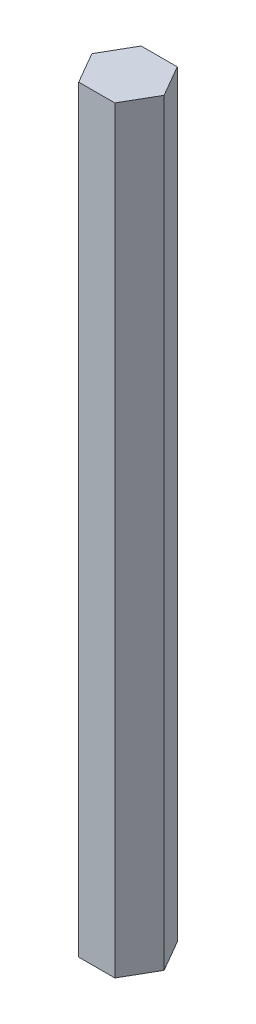
ISO-10303-21;
HEADER;
FILE_DESCRIPTION(('STEP AP214'),'2;1');
FILE_NAME('part.step','',(''),(''),'','','');
FILE_SCHEMA(('AUTOMOTIVE_DESIGN { 1 0 10303 214 1 1 1 1 }'));
ENDSEC;
DATA;
#1=APPLICATION_CONTEXT('core data for automotive mechanical design processes');
#2=APPLICATION_PROTOCOL_DEFINITION('international standard','automotive_design',2000,#1);
#3=PRODUCT_CONTEXT('',#1,'mechanical');
#4=PRODUCT('Part','Part','',(#3));
#5=PRODUCT_RELATED_PRODUCT_CATEGORY('part','',(#4));
#6=PRODUCT_DEFINITION_FORMATION('','',#4);
#7=PRODUCT_DEFINITION_CONTEXT('part definition',#1,'design');
#8=PRODUCT_DEFINITION('design','',#6,#7);
#9=PRODUCT_DEFINITION_SHAPE('','',#8);
#10=(LENGTH_UNIT() NAMED_UNIT(*) SI_UNIT(.MILLI.,.METRE.));
#11=(NAMED_UNIT(*) PLANE_ANGLE_UNIT() SI_UNIT($,.RADIAN.));
#12=(NAMED_UNIT(*) SI_UNIT($,.STERADIAN.) SOLID_ANGLE_UNIT());
#13=UNCERTAINTY_MEASURE_WITH_UNIT(LENGTH_MEASURE(1.E-05),#10,'distance_accuracy_value','');
#14=(GEOMETRIC_REPRESENTATION_CONTEXT(3) GLOBAL_UNCERTAINTY_ASSIGNED_CONTEXT((#13)) GLOBAL_UNIT_ASSIGNED_CONTEXT((#10,
#11,#12)) REPRESENTATION_CONTEXT('',''));
#15=CARTESIAN_POINT('',(0.,0.,0.));
#16=DIRECTION('',(0.,0.,1.));
#17=DIRECTION('',(1.,0.,0.));
#18=AXIS2_PLACEMENT_3D('',#15,#16,#17);
#19=CARTESIAN_POINT('',(1.5,63.,2.59807621135332));
#20=DIRECTION('',(-0.866025403784439,0.,-0.5));
#21=DIRECTION('',(-0.5,0.,0.866025403784439));
#22=AXIS2_PLACEMENT_3D('',#19,#20,#21);
#23=PLANE('',#22);
#24=DIRECTION('',(0.5,0.,-0.866025403784439));
#25=VECTOR('',#24,1.);
#26=CARTESIAN_POINT('',(1.5,0.,2.59807621135332));
#27=LINE('',#26,#25);
#28=CARTESIAN_POINT('',(1.5,0.,2.59807621135332));
#29=VERTEX_POINT('',#28);
#30=CARTESIAN_POINT('',(3.,0.,0.));
#31=VERTEX_POINT('',#30);
#32=EDGE_CURVE('E116',#29,#31,#27,.T.);
#33=ORIENTED_EDGE('',*,*,#32,.T.);
#34=DIRECTION('',(0.,-1.,0.));
#35=VECTOR('',#34,1.);
#36=CARTESIAN_POINT('',(3.,63.,0.));
#37=LINE('',#36,#35);
#38=CARTESIAN_POINT('',(3.,63.,0.));
#39=VERTEX_POINT('',#38);
#40=EDGE_CURVE('E11',#39,#31,#37,.T.);
#41=ORIENTED_EDGE('',*,*,#40,.F.);
#42=DIRECTION('',(0.5,0.,-0.866025403784439));
#43=VECTOR('',#42,1.);
#44=CARTESIAN_POINT('',(1.5,63.,2.59807621135332));
#45=LINE('',#44,#43);
#46=CARTESIAN_POINT('',(1.5,63.,2.59807621135332));
#47=VERTEX_POINT('',#46);
#48=EDGE_CURVE('E127',#47,#39,#45,.T.);
#49=ORIENTED_EDGE('',*,*,#48,.F.);
#50=DIRECTION('',(0.,-1.,0.));
#51=VECTOR('',#50,1.);
#52=CARTESIAN_POINT('',(1.5,63.,2.59807621135332));
#53=LINE('',#52,#51);
#54=EDGE_CURVE('E112',#47,#29,#53,.T.);
#55=ORIENTED_EDGE('',*,*,#54,.T.);
#56=EDGE_LOOP('',(#33,#41,#49,#55));
#57=FACE_BOUND('',#56,.T.);
#58=ADVANCED_FACE('F32',(#57),#23,.F.);
#59=CARTESIAN_POINT('',(3.,63.,0.));
#60=DIRECTION('',(-0.866025403784439,0.,0.5));
#61=DIRECTION('',(0.5,0.,0.866025403784439));
#62=AXIS2_PLACEMENT_3D('',#59,#60,#61);
#63=PLANE('',#62);
#64=DIRECTION('',(-0.5,0.,-0.866025403784439));
#65=VECTOR('',#64,1.);
#66=CARTESIAN_POINT('',(3.,0.,0.));
#67=LINE('',#66,#65);
#68=CARTESIAN_POINT('',(1.5,0.,-2.59807621135332));
#69=VERTEX_POINT('',#68);
#70=EDGE_CURVE('E119',#31,#69,#67,.T.);
#71=ORIENTED_EDGE('',*,*,#70,.T.);
#72=DIRECTION('',(0.,-1.,0.));
#73=VECTOR('',#72,1.);
#74=CARTESIAN_POINT('',(1.5,63.,-2.59807621135332));
#75=LINE('',#74,#73);
#76=CARTESIAN_POINT('',(1.5,63.,-2.59807621135332));
#77=VERTEX_POINT('',#76);
#78=EDGE_CURVE('E40',#77,#69,#75,.T.);
#79=ORIENTED_EDGE('',*,*,#78,.F.);
#80=DIRECTION('',(-0.5,0.,-0.866025403784439));
#81=VECTOR('',#80,1.);
#82=CARTESIAN_POINT('',(3.,63.,0.));
#83=LINE('',#82,#81);
#84=EDGE_CURVE('E85',#39,#77,#83,.T.);
#85=ORIENTED_EDGE('',*,*,#84,.F.);
#86=ORIENTED_EDGE('',*,*,#40,.T.);
#87=EDGE_LOOP('',(#71,#79,#85,#86));
#88=FACE_BOUND('',#87,.T.);
#89=ADVANCED_FACE('F151',(#88),#63,.F.);
#90=CARTESIAN_POINT('',(1.5,63.,-2.59807621135332));
#91=DIRECTION('',(0.,0.,1.));
#92=DIRECTION('',(1.,0.,0.));
#93=AXIS2_PLACEMENT_3D('',#90,#91,#92);
#94=PLANE('',#93);
#95=DIRECTION('',(-1.,0.,0.));
#96=VECTOR('',#95,1.);
#97=CARTESIAN_POINT('',(1.5,0.,-2.59807621135332));
#98=LINE('',#97,#96);
#99=CARTESIAN_POINT('',(-1.5,0.,-2.59807621135332));
#100=VERTEX_POINT('',#99);
#101=EDGE_CURVE('E122',#69,#100,#98,.T.);
#102=ORIENTED_EDGE('',*,*,#101,.T.);
#103=DIRECTION('',(0.,-1.,0.));
#104=VECTOR('',#103,1.);
#105=CARTESIAN_POINT('',(-1.5,63.,-2.59807621135332));
#106=LINE('',#105,#104);
#107=CARTESIAN_POINT('',(-1.5,63.,-2.59807621135332));
#108=VERTEX_POINT('',#107);
#109=EDGE_CURVE('E107',#108,#100,#106,.T.);
#110=ORIENTED_EDGE('',*,*,#109,.F.);
#111=DIRECTION('',(-1.,0.,0.));
#112=VECTOR('',#111,1.);
#113=CARTESIAN_POINT('',(1.5,63.,-2.59807621135332));
#114=LINE('',#113,#112);
#115=EDGE_CURVE('E98',#77,#108,#114,.T.);
#116=ORIENTED_EDGE('',*,*,#115,.F.);
#117=ORIENTED_EDGE('',*,*,#78,.T.);
#118=EDGE_LOOP('',(#102,#110,#116,#117));
#119=FACE_BOUND('',#118,.T.);
#120=ADVANCED_FACE('F133',(#119),#94,.F.);
#121=CARTESIAN_POINT('',(-1.5,63.,-2.59807621135332));
#122=DIRECTION('',(0.866025403784439,0.,0.5));
#123=DIRECTION('',(0.5,0.,-0.866025403784439));
#124=AXIS2_PLACEMENT_3D('',#121,#122,#123);
#125=PLANE('',#124);
#126=DIRECTION('',(-0.5,0.,0.866025403784439));
#127=VECTOR('',#126,1.);
#128=CARTESIAN_POINT('',(-1.5,0.,-2.59807621135332));
#129=LINE('',#128,#127);
#130=CARTESIAN_POINT('',(-3.,0.,0.));
#131=VERTEX_POINT('',#130);
#132=EDGE_CURVE('E106',#100,#131,#129,.T.);
#133=ORIENTED_EDGE('',*,*,#132,.T.);
#134=DIRECTION('',(0.,-1.,0.));
#135=VECTOR('',#134,1.);
#136=CARTESIAN_POINT('',(-3.,63.,0.));
#137=LINE('',#136,#135);
#138=CARTESIAN_POINT('',(-3.,63.,0.));
#139=VERTEX_POINT('',#138);
#140=EDGE_CURVE('E103',#139,#131,#137,.T.);
#141=ORIENTED_EDGE('',*,*,#140,.F.);
#142=DIRECTION('',(-0.5,0.,0.866025403784439));
#143=VECTOR('',#142,1.);
#144=CARTESIAN_POINT('',(-1.5,63.,-2.59807621135332));
#145=LINE('',#144,#143);
#146=EDGE_CURVE('E92',#108,#139,#145,.T.);
#147=ORIENTED_EDGE('',*,*,#146,.F.);
#148=ORIENTED_EDGE('',*,*,#109,.T.);
#149=EDGE_LOOP('',(#133,#141,#147,#148));
#150=FACE_BOUND('',#149,.T.);
#151=ADVANCED_FACE('F104',(#150),#125,.F.);
#152=CARTESIAN_POINT('',(-3.,63.,0.));
#153=DIRECTION('',(0.866025403784439,0.,-0.5));
#154=DIRECTION('',(-0.5,0.,-0.866025403784439));
#155=AXIS2_PLACEMENT_3D('',#152,#153,#154);
#156=PLANE('',#155);
#157=DIRECTION('',(0.5,0.,0.866025403784439));
#158=VECTOR('',#157,1.);
#159=CARTESIAN_POINT('',(-3.,0.,0.));
#160=LINE('',#159,#158);
#161=CARTESIAN_POINT('',(-1.5,0.,2.59807621135332));
#162=VERTEX_POINT('',#161);
#163=EDGE_CURVE('E71',#131,#162,#160,.T.);
#164=ORIENTED_EDGE('',*,*,#163,.T.);
#165=DIRECTION('',(0.,-1.,0.));
#166=VECTOR('',#165,1.);
#167=CARTESIAN_POINT('',(-1.5,63.,2.59807621135332));
#168=LINE('',#167,#166);
#169=CARTESIAN_POINT('',(-1.5,63.,2.59807621135332));
#170=VERTEX_POINT('',#169);
#171=EDGE_CURVE('E108',#170,#162,#168,.T.);
#172=ORIENTED_EDGE('',*,*,#171,.F.);
#173=DIRECTION('',(0.5,0.,0.866025403784439));
#174=VECTOR('',#173,1.);
#175=CARTESIAN_POINT('',(-3.,63.,0.));
#176=LINE('',#175,#174);
#177=EDGE_CURVE('E96',#139,#170,#176,.T.);
#178=ORIENTED_EDGE('',*,*,#177,.F.);
#179=ORIENTED_EDGE('',*,*,#140,.T.);
#180=EDGE_LOOP('',(#164,#172,#178,#179));
#181=FACE_BOUND('',#180,.T.);
#182=ADVANCED_FACE('F110',(#181),#156,.F.);
#183=CARTESIAN_POINT('',(-1.5,63.,2.59807621135332));
#184=DIRECTION('',(0.,0.,-1.));
#185=DIRECTION('',(-1.,0.,0.));
#186=AXIS2_PLACEMENT_3D('',#183,#184,#185);
#187=PLANE('',#186);
#188=DIRECTION('',(1.,0.,0.));
#189=VECTOR('',#188,1.);
#190=CARTESIAN_POINT('',(-1.5,0.,2.59807621135332));
#191=LINE('',#190,#189);
#192=EDGE_CURVE('E77',#162,#29,#191,.T.);
#193=ORIENTED_EDGE('',*,*,#192,.T.);
#194=ORIENTED_EDGE('',*,*,#54,.F.);
#195=DIRECTION('',(1.,0.,0.));
#196=VECTOR('',#195,1.);
#197=CARTESIAN_POINT('',(-1.5,63.,2.59807621135332));
#198=LINE('',#197,#196);
#199=EDGE_CURVE('E48',#170,#47,#198,.T.);
#200=ORIENTED_EDGE('',*,*,#199,.F.);
#201=ORIENTED_EDGE('',*,*,#171,.T.);
#202=EDGE_LOOP('',(#193,#194,#200,#201));
#203=FACE_BOUND('',#202,.T.);
#204=ADVANCED_FACE('F140',(#203),#187,.F.);
#205=CARTESIAN_POINT('',(0.,63.,0.));
#206=DIRECTION('',(0.,1.,0.));
#207=DIRECTION('',(0.,0.,1.));
#208=AXIS2_PLACEMENT_3D('',#205,#206,#207);
#209=PLANE('',#208);
#210=ORIENTED_EDGE('',*,*,#48,.T.);
#211=ORIENTED_EDGE('',*,*,#84,.T.);
#212=ORIENTED_EDGE('',*,*,#115,.T.);
#213=ORIENTED_EDGE('',*,*,#146,.T.);
#214=ORIENTED_EDGE('',*,*,#177,.T.);
#215=ORIENTED_EDGE('',*,*,#199,.T.);
#216=EDGE_LOOP('',(#210,#211,#212,#213,#214,#215));
#217=FACE_BOUND('',#216,.T.);
#218=ADVANCED_FACE('F94',(#217),#209,.T.);
#219=CARTESIAN_POINT('',(0.,0.,0.));
#220=DIRECTION('',(0.,1.,0.));
#221=DIRECTION('',(0.,0.,1.));
#222=AXIS2_PLACEMENT_3D('',#219,#220,#221);
#223=PLANE('',#222);
#224=CARTESIAN_POINT('',(0.,0.,0.));
#225=DIRECTION('',(0.,-1.,0.));
#226=DIRECTION('',(0.,0.,-1.));
#227=AXIS2_PLACEMENT_3D('',#224,#225,#226);
#228=CIRCLE('',#227,1.6);
#229=CARTESIAN_POINT('',(0.,0.,-1.6));
#230=VERTEX_POINT('',#229);
#231=EDGE_CURVE('E213',#230,#230,#228,.T.);
#232=ORIENTED_EDGE('',*,*,#231,.F.);
#233=EDGE_LOOP('',(#232));
#234=FACE_BOUND('',#233,.T.);
#235=ORIENTED_EDGE('',*,*,#32,.F.);
#236=ORIENTED_EDGE('',*,*,#192,.F.);
#237=ORIENTED_EDGE('',*,*,#163,.F.);
#238=ORIENTED_EDGE('',*,*,#132,.F.);
#239=ORIENTED_EDGE('',*,*,#101,.F.);
#240=ORIENTED_EDGE('',*,*,#70,.F.);
#241=EDGE_LOOP('',(#235,#236,#237,#238,#239,#240));
#242=FACE_BOUND('',#241,.T.);
#243=ADVANCED_FACE('F136',(#234,#242),#223,.F.);
#244=CARTESIAN_POINT('',(0.,5.,0.));
#245=DIRECTION('',(0.,-1.,0.));
#246=DIRECTION('',(0.,0.,-1.));
#247=AXIS2_PLACEMENT_3D('',#244,#245,#246);
#248=CYLINDRICAL_SURFACE('',#247,1.6);
#249=CARTESIAN_POINT('',(0.,5.,0.));
#250=DIRECTION('',(0.,-1.,0.));
#251=DIRECTION('',(0.,0.,-1.));
#252=AXIS2_PLACEMENT_3D('',#249,#250,#251);
#253=CIRCLE('',#252,1.6);
#254=CARTESIAN_POINT('',(0.,5.,-1.6));
#255=VERTEX_POINT('',#254);
#256=EDGE_CURVE('E120',#255,#255,#253,.T.);
#257=ORIENTED_EDGE('',*,*,#256,.F.);
#258=EDGE_LOOP('',(#257));
#259=FACE_BOUND('',#258,.T.);
#260=ORIENTED_EDGE('',*,*,#231,.T.);
#261=EDGE_LOOP('',(#260));
#262=FACE_BOUND('',#261,.T.);
#263=ADVANCED_FACE('F188',(#259,#262),#248,.F.);
#264=CARTESIAN_POINT('',(0.,5.,0.));
#265=DIRECTION('',(0.,-1.,0.));
#266=DIRECTION('',(0.,0.,-1.));
#267=AXIS2_PLACEMENT_3D('',#264,#265,#266);
#268=PLANE('',#267);
#269=ORIENTED_EDGE('',*,*,#256,.T.);
#270=EDGE_LOOP('',(#269));
#271=FACE_BOUND('',#270,.T.);
#272=ADVANCED_FACE('F197',(#271),#268,.T.);
#273=CLOSED_SHELL('',(#58,#89,#120,#151,#182,#204,#218,#243,#263,#272));
#274=MANIFOLD_SOLID_BREP('B2',#273);
#275=ADVANCED_BREP_SHAPE_REPRESENTATION('',(#18,#274),#14);
#276=SHAPE_DEFINITION_REPRESENTATION(#9,#275);
ENDSEC;
END-ISO-10303-21;
